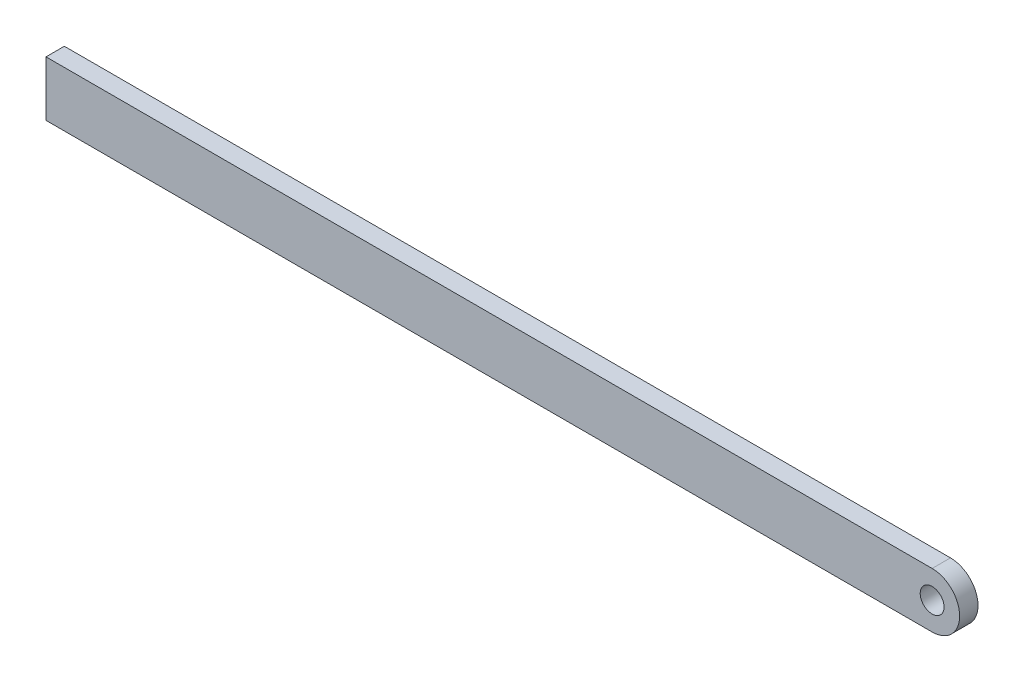
ISO-10303-21;
HEADER;
FILE_DESCRIPTION(('STEP AP214'),'2;1');
FILE_NAME('part.step','',(''),(''),'','','');
FILE_SCHEMA(('AUTOMOTIVE_DESIGN { 1 0 10303 214 1 1 1 1 }'));
ENDSEC;
DATA;
#1=APPLICATION_CONTEXT('core data for automotive mechanical design processes');
#2=APPLICATION_PROTOCOL_DEFINITION('international standard','automotive_design',2000,#1);
#3=PRODUCT_CONTEXT('',#1,'mechanical');
#4=PRODUCT('Part','Part','',(#3));
#5=PRODUCT_RELATED_PRODUCT_CATEGORY('part','',(#4));
#6=PRODUCT_DEFINITION_FORMATION('','',#4);
#7=PRODUCT_DEFINITION_CONTEXT('part definition',#1,'design');
#8=PRODUCT_DEFINITION('design','',#6,#7);
#9=PRODUCT_DEFINITION_SHAPE('','',#8);
#10=(LENGTH_UNIT() NAMED_UNIT(*) SI_UNIT(.MILLI.,.METRE.));
#11=(NAMED_UNIT(*) PLANE_ANGLE_UNIT() SI_UNIT($,.RADIAN.));
#12=(NAMED_UNIT(*) SI_UNIT($,.STERADIAN.) SOLID_ANGLE_UNIT());
#13=UNCERTAINTY_MEASURE_WITH_UNIT(LENGTH_MEASURE(1.E-05),#10,'distance_accuracy_value','');
#14=(GEOMETRIC_REPRESENTATION_CONTEXT(3) GLOBAL_UNCERTAINTY_ASSIGNED_CONTEXT((#13)) GLOBAL_UNIT_ASSIGNED_CONTEXT((#10,
#11,#12)) REPRESENTATION_CONTEXT('',''));
#15=CARTESIAN_POINT('',(0.,0.,0.));
#16=DIRECTION('',(0.,0.,1.));
#17=DIRECTION('',(1.,0.,0.));
#18=AXIS2_PLACEMENT_3D('',#15,#16,#17);
#19=CARTESIAN_POINT('',(241.46,0.,2.5));
#20=DIRECTION('',(0.,0.,1.));
#21=DIRECTION('',(1.,0.,0.));
#22=AXIS2_PLACEMENT_3D('',#19,#20,#21);
#23=PLANE('',#22);
#24=DIRECTION('',(0.,-1.,0.));
#25=VECTOR('',#24,1.);
#26=CARTESIAN_POINT('',(0.,7.5,2.5));
#27=LINE('',#26,#25);
#28=CARTESIAN_POINT('',(0.,7.5,2.5));
#29=VERTEX_POINT('',#28);
#30=CARTESIAN_POINT('',(0.,-7.5,2.5));
#31=VERTEX_POINT('',#30);
#32=EDGE_CURVE('E92',#29,#31,#27,.T.);
#33=ORIENTED_EDGE('',*,*,#32,.T.);
#34=DIRECTION('',(1.,0.,0.));
#35=VECTOR('',#34,1.);
#36=CARTESIAN_POINT('',(0.,-7.5,2.5));
#37=LINE('',#36,#35);
#38=CARTESIAN_POINT('',(241.46,-7.5,2.5));
#39=VERTEX_POINT('',#38);
#40=EDGE_CURVE('E87',#31,#39,#37,.T.);
#41=ORIENTED_EDGE('',*,*,#40,.T.);
#42=CARTESIAN_POINT('',(241.46,0.,2.5));
#43=DIRECTION('',(0.,0.,1.));
#44=DIRECTION('',(1.,0.,0.));
#45=AXIS2_PLACEMENT_3D('',#42,#43,#44);
#46=CIRCLE('',#45,7.5);
#47=CARTESIAN_POINT('',(241.46,7.5,2.5));
#48=VERTEX_POINT('',#47);
#49=EDGE_CURVE('E90',#39,#48,#46,.T.);
#50=ORIENTED_EDGE('',*,*,#49,.T.);
#51=DIRECTION('',(-1.,0.,0.));
#52=VECTOR('',#51,1.);
#53=CARTESIAN_POINT('',(0.,7.5,2.5));
#54=LINE('',#53,#52);
#55=EDGE_CURVE('E57',#48,#29,#54,.T.);
#56=ORIENTED_EDGE('',*,*,#55,.T.);
#57=EDGE_LOOP('',(#33,#41,#50,#56));
#58=FACE_BOUND('',#57,.T.);
#59=CARTESIAN_POINT('',(241.46,0.,2.5));
#60=DIRECTION('',(0.,0.,1.));
#61=DIRECTION('',(1.,0.,0.));
#62=AXIS2_PLACEMENT_3D('',#59,#60,#61);
#63=CIRCLE('',#62,3.25000000000001);
#64=CARTESIAN_POINT('',(244.71,0.,2.5));
#65=VERTEX_POINT('',#64);
#66=EDGE_CURVE('E112',#65,#65,#63,.T.);
#67=ORIENTED_EDGE('',*,*,#66,.F.);
#68=EDGE_LOOP('',(#67));
#69=FACE_BOUND('',#68,.T.);
#70=ADVANCED_FACE('F39',(#58,#69),#23,.T.);
#71=CARTESIAN_POINT('',(241.46,0.,-2.5));
#72=DIRECTION('',(0.,0.,1.));
#73=DIRECTION('',(1.,0.,0.));
#74=AXIS2_PLACEMENT_3D('',#71,#72,#73);
#75=PLANE('',#74);
#76=DIRECTION('',(0.,-1.,0.));
#77=VECTOR('',#76,1.);
#78=CARTESIAN_POINT('',(0.,7.5,-2.5));
#79=LINE('',#78,#77);
#80=CARTESIAN_POINT('',(0.,7.5,-2.5));
#81=VERTEX_POINT('',#80);
#82=CARTESIAN_POINT('',(0.,-7.5,-2.5));
#83=VERTEX_POINT('',#82);
#84=EDGE_CURVE('E108',#81,#83,#79,.T.);
#85=ORIENTED_EDGE('',*,*,#84,.F.);
#86=DIRECTION('',(-1.,0.,0.));
#87=VECTOR('',#86,1.);
#88=CARTESIAN_POINT('',(0.,7.5,-2.5));
#89=LINE('',#88,#87);
#90=CARTESIAN_POINT('',(241.46,7.5,-2.5));
#91=VERTEX_POINT('',#90);
#92=EDGE_CURVE('E80',#91,#81,#89,.T.);
#93=ORIENTED_EDGE('',*,*,#92,.F.);
#94=CARTESIAN_POINT('',(241.46,0.,-2.5));
#95=DIRECTION('',(0.,0.,1.));
#96=DIRECTION('',(1.,0.,0.));
#97=AXIS2_PLACEMENT_3D('',#94,#95,#96);
#98=CIRCLE('',#97,7.5);
#99=CARTESIAN_POINT('',(241.46,-7.5,-2.5));
#100=VERTEX_POINT('',#99);
#101=EDGE_CURVE('E74',#100,#91,#98,.T.);
#102=ORIENTED_EDGE('',*,*,#101,.F.);
#103=DIRECTION('',(1.,0.,0.));
#104=VECTOR('',#103,1.);
#105=CARTESIAN_POINT('',(0.,-7.5,-2.5));
#106=LINE('',#105,#104);
#107=EDGE_CURVE('E97',#83,#100,#106,.T.);
#108=ORIENTED_EDGE('',*,*,#107,.F.);
#109=EDGE_LOOP('',(#85,#93,#102,#108));
#110=FACE_BOUND('',#109,.T.);
#111=CARTESIAN_POINT('',(241.46,0.,-2.5));
#112=DIRECTION('',(0.,0.,1.));
#113=DIRECTION('',(1.,0.,0.));
#114=AXIS2_PLACEMENT_3D('',#111,#112,#113);
#115=CIRCLE('',#114,3.25000000000001);
#116=CARTESIAN_POINT('',(244.71,0.,-2.5));
#117=VERTEX_POINT('',#116);
#118=EDGE_CURVE('E130',#117,#117,#115,.T.);
#119=ORIENTED_EDGE('',*,*,#118,.T.);
#120=EDGE_LOOP('',(#119));
#121=FACE_BOUND('',#120,.T.);
#122=ADVANCED_FACE('F125',(#110,#121),#75,.F.);
#123=CARTESIAN_POINT('',(0.,7.5,2.5));
#124=DIRECTION('',(1.,0.,0.));
#125=DIRECTION('',(0.,1.,0.));
#126=AXIS2_PLACEMENT_3D('',#123,#124,#125);
#127=PLANE('',#126);
#128=ORIENTED_EDGE('',*,*,#84,.T.);
#129=DIRECTION('',(0.,0.,-1.));
#130=VECTOR('',#129,1.);
#131=CARTESIAN_POINT('',(0.,-7.5,2.5));
#132=LINE('',#131,#130);
#133=EDGE_CURVE('E11',#31,#83,#132,.T.);
#134=ORIENTED_EDGE('',*,*,#133,.F.);
#135=ORIENTED_EDGE('',*,*,#32,.F.);
#136=DIRECTION('',(0.,0.,-1.));
#137=VECTOR('',#136,1.);
#138=CARTESIAN_POINT('',(0.,7.5,2.5));
#139=LINE('',#138,#137);
#140=EDGE_CURVE('E104',#29,#81,#139,.T.);
#141=ORIENTED_EDGE('',*,*,#140,.T.);
#142=EDGE_LOOP('',(#128,#134,#135,#141));
#143=FACE_BOUND('',#142,.T.);
#144=ADVANCED_FACE('F41',(#143),#127,.F.);
#145=CARTESIAN_POINT('',(0.,-7.5,2.5));
#146=DIRECTION('',(0.,1.,0.));
#147=DIRECTION('',(0.,0.,1.));
#148=AXIS2_PLACEMENT_3D('',#145,#146,#147);
#149=PLANE('',#148);
#150=ORIENTED_EDGE('',*,*,#107,.T.);
#151=DIRECTION('',(0.,0.,-1.));
#152=VECTOR('',#151,1.);
#153=CARTESIAN_POINT('',(241.46,-7.5,2.5));
#154=LINE('',#153,#152);
#155=EDGE_CURVE('E49',#39,#100,#154,.T.);
#156=ORIENTED_EDGE('',*,*,#155,.F.);
#157=ORIENTED_EDGE('',*,*,#40,.F.);
#158=ORIENTED_EDGE('',*,*,#133,.T.);
#159=EDGE_LOOP('',(#150,#156,#157,#158));
#160=FACE_BOUND('',#159,.T.);
#161=ADVANCED_FACE('F96',(#160),#149,.F.);
#162=CARTESIAN_POINT('',(241.46,0.,2.5));
#163=DIRECTION('',(0.,0.,-1.));
#164=DIRECTION('',(-1.,0.,0.));
#165=AXIS2_PLACEMENT_3D('',#162,#163,#164);
#166=CYLINDRICAL_SURFACE('',#165,7.5);
#167=ORIENTED_EDGE('',*,*,#101,.T.);
#168=DIRECTION('',(0.,0.,-1.));
#169=VECTOR('',#168,1.);
#170=CARTESIAN_POINT('',(241.46,7.5,2.5));
#171=LINE('',#170,#169);
#172=EDGE_CURVE('E99',#48,#91,#171,.T.);
#173=ORIENTED_EDGE('',*,*,#172,.F.);
#174=ORIENTED_EDGE('',*,*,#49,.F.);
#175=ORIENTED_EDGE('',*,*,#155,.T.);
#176=EDGE_LOOP('',(#167,#173,#174,#175));
#177=FACE_BOUND('',#176,.T.);
#178=ADVANCED_FACE('F100',(#177),#166,.T.);
#179=CARTESIAN_POINT('',(0.,7.5,2.5));
#180=DIRECTION('',(0.,-1.,0.));
#181=DIRECTION('',(0.,0.,-1.));
#182=AXIS2_PLACEMENT_3D('',#179,#180,#181);
#183=PLANE('',#182);
#184=ORIENTED_EDGE('',*,*,#92,.T.);
#185=ORIENTED_EDGE('',*,*,#140,.F.);
#186=ORIENTED_EDGE('',*,*,#55,.F.);
#187=ORIENTED_EDGE('',*,*,#172,.T.);
#188=EDGE_LOOP('',(#184,#185,#186,#187));
#189=FACE_BOUND('',#188,.T.);
#190=ADVANCED_FACE('F122',(#189),#183,.F.);
#191=CARTESIAN_POINT('',(241.46,0.,2.5));
#192=DIRECTION('',(0.,0.,-1.));
#193=DIRECTION('',(-1.,0.,0.));
#194=AXIS2_PLACEMENT_3D('',#191,#192,#193);
#195=CYLINDRICAL_SURFACE('',#194,3.25000000000001);
#196=ORIENTED_EDGE('',*,*,#66,.T.);
#197=EDGE_LOOP('',(#196));
#198=FACE_BOUND('',#197,.T.);
#199=ORIENTED_EDGE('',*,*,#118,.F.);
#200=EDGE_LOOP('',(#199));
#201=FACE_BOUND('',#200,.T.);
#202=ADVANCED_FACE('F138',(#198,#201),#195,.F.);
#203=CLOSED_SHELL('',(#70,#122,#144,#161,#178,#190,#202));
#204=MANIFOLD_SOLID_BREP('B2',#203);
#205=ADVANCED_BREP_SHAPE_REPRESENTATION('',(#18,#204),#14);
#206=SHAPE_DEFINITION_REPRESENTATION(#9,#205);
ENDSEC;
END-ISO-10303-21;
